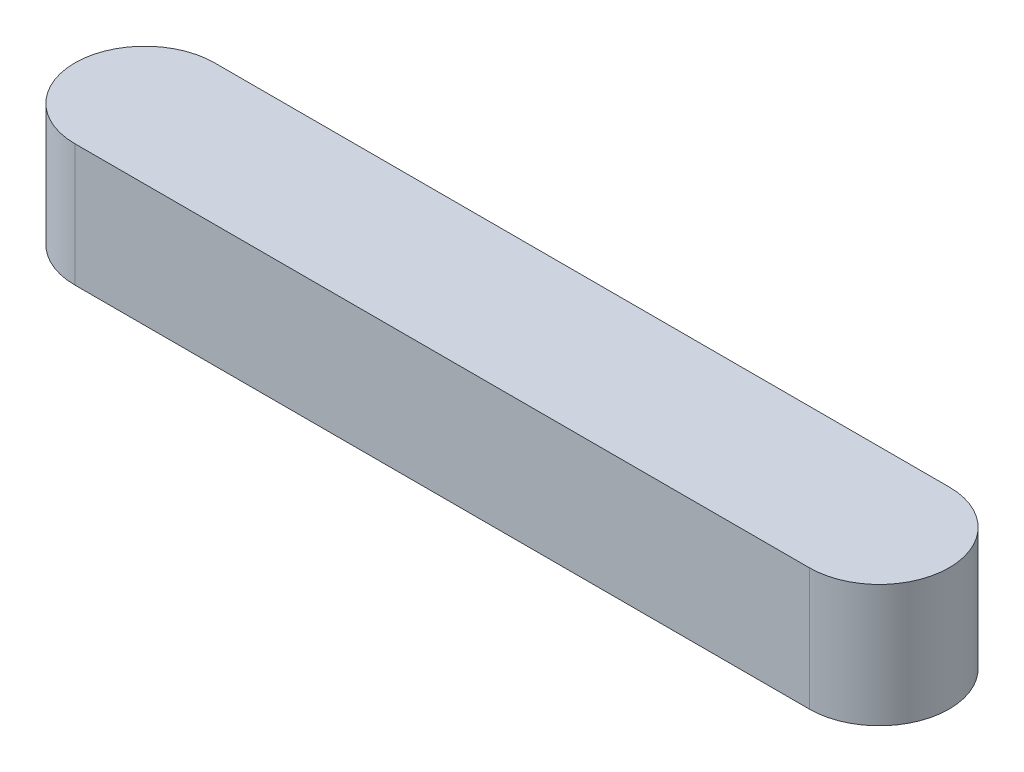
ISO-10303-21;
HEADER;
FILE_DESCRIPTION(('STEP AP214'),'2;1');
FILE_NAME('part.step','',(''),(''),'','','');
FILE_SCHEMA(('AUTOMOTIVE_DESIGN { 1 0 10303 214 1 1 1 1 }'));
ENDSEC;
DATA;
#1=APPLICATION_CONTEXT('core data for automotive mechanical design processes');
#2=APPLICATION_PROTOCOL_DEFINITION('international standard','automotive_design',2000,#1);
#3=PRODUCT_CONTEXT('',#1,'mechanical');
#4=PRODUCT('Part','Part','',(#3));
#5=PRODUCT_RELATED_PRODUCT_CATEGORY('part','',(#4));
#6=PRODUCT_DEFINITION_FORMATION('','',#4);
#7=PRODUCT_DEFINITION_CONTEXT('part definition',#1,'design');
#8=PRODUCT_DEFINITION('design','',#6,#7);
#9=PRODUCT_DEFINITION_SHAPE('','',#8);
#10=(LENGTH_UNIT() NAMED_UNIT(*) SI_UNIT(.MILLI.,.METRE.));
#11=(NAMED_UNIT(*) PLANE_ANGLE_UNIT() SI_UNIT($,.RADIAN.));
#12=(NAMED_UNIT(*) SI_UNIT($,.STERADIAN.) SOLID_ANGLE_UNIT());
#13=UNCERTAINTY_MEASURE_WITH_UNIT(LENGTH_MEASURE(1.E-05),#10,'distance_accuracy_value','');
#14=(GEOMETRIC_REPRESENTATION_CONTEXT(3) GLOBAL_UNCERTAINTY_ASSIGNED_CONTEXT((#13)) GLOBAL_UNIT_ASSIGNED_CONTEXT((#10,
#11,#12)) REPRESENTATION_CONTEXT('',''));
#15=CARTESIAN_POINT('',(0.,0.,0.));
#16=DIRECTION('',(0.,0.,1.));
#17=DIRECTION('',(1.,0.,0.));
#18=AXIS2_PLACEMENT_3D('',#15,#16,#17);
#19=CARTESIAN_POINT('',(0.,7.,0.));
#20=DIRECTION('',(0.,-1.,0.));
#21=DIRECTION('',(0.,0.,-1.));
#22=AXIS2_PLACEMENT_3D('',#19,#20,#21);
#23=CYLINDRICAL_SURFACE('',#22,4.);
#24=CARTESIAN_POINT('',(0.,0.,0.));
#25=DIRECTION('',(0.,1.,0.));
#26=DIRECTION('',(0.,0.,1.));
#27=AXIS2_PLACEMENT_3D('',#24,#25,#26);
#28=CIRCLE('',#27,4.);
#29=CARTESIAN_POINT('',(0.,0.,-4.));
#30=VERTEX_POINT('',#29);
#31=CARTESIAN_POINT('',(0.,0.,4.));
#32=VERTEX_POINT('',#31);
#33=EDGE_CURVE('E98',#30,#32,#28,.T.);
#34=ORIENTED_EDGE('',*,*,#33,.T.);
#35=DIRECTION('',(0.,-1.,0.));
#36=VECTOR('',#35,1.);
#37=CARTESIAN_POINT('',(0.,7.,4.));
#38=LINE('',#37,#36);
#39=CARTESIAN_POINT('',(0.,7.,4.));
#40=VERTEX_POINT('',#39);
#41=EDGE_CURVE('E11',#40,#32,#38,.T.);
#42=ORIENTED_EDGE('',*,*,#41,.F.);
#43=CARTESIAN_POINT('',(0.,7.,0.));
#44=DIRECTION('',(0.,1.,0.));
#45=DIRECTION('',(0.,0.,1.));
#46=AXIS2_PLACEMENT_3D('',#43,#44,#45);
#47=CIRCLE('',#46,4.);
#48=CARTESIAN_POINT('',(0.,7.,-4.));
#49=VERTEX_POINT('',#48);
#50=EDGE_CURVE('E86',#49,#40,#47,.T.);
#51=ORIENTED_EDGE('',*,*,#50,.F.);
#52=DIRECTION('',(0.,-1.,0.));
#53=VECTOR('',#52,1.);
#54=CARTESIAN_POINT('',(0.,7.,-4.));
#55=LINE('',#54,#53);
#56=EDGE_CURVE('E94',#49,#30,#55,.T.);
#57=ORIENTED_EDGE('',*,*,#56,.T.);
#58=EDGE_LOOP('',(#34,#42,#51,#57));
#59=FACE_BOUND('',#58,.T.);
#60=ADVANCED_FACE('F35',(#59),#23,.T.);
#61=CARTESIAN_POINT('',(0.,7.,4.));
#62=DIRECTION('',(0.,0.,-1.));
#63=DIRECTION('',(-1.,0.,0.));
#64=AXIS2_PLACEMENT_3D('',#61,#62,#63);
#65=PLANE('',#64);
#66=DIRECTION('',(1.,0.,0.));
#67=VECTOR('',#66,1.);
#68=CARTESIAN_POINT('',(0.,0.,4.));
#69=LINE('',#68,#67);
#70=CARTESIAN_POINT('',(42.,0.,4.));
#71=VERTEX_POINT('',#70);
#72=EDGE_CURVE('E90',#32,#71,#69,.T.);
#73=ORIENTED_EDGE('',*,*,#72,.T.);
#74=DIRECTION('',(0.,-1.,0.));
#75=VECTOR('',#74,1.);
#76=CARTESIAN_POINT('',(42.,7.,4.));
#77=LINE('',#76,#75);
#78=CARTESIAN_POINT('',(42.,7.,4.));
#79=VERTEX_POINT('',#78);
#80=EDGE_CURVE('E43',#79,#71,#77,.T.);
#81=ORIENTED_EDGE('',*,*,#80,.F.);
#82=DIRECTION('',(1.,0.,0.));
#83=VECTOR('',#82,1.);
#84=CARTESIAN_POINT('',(0.,7.,4.));
#85=LINE('',#84,#83);
#86=EDGE_CURVE('E81',#40,#79,#85,.T.);
#87=ORIENTED_EDGE('',*,*,#86,.F.);
#88=ORIENTED_EDGE('',*,*,#41,.T.);
#89=EDGE_LOOP('',(#73,#81,#87,#88));
#90=FACE_BOUND('',#89,.T.);
#91=ADVANCED_FACE('F89',(#90),#65,.F.);
#92=CARTESIAN_POINT('',(42.,7.,0.));
#93=DIRECTION('',(0.,-1.,0.));
#94=DIRECTION('',(0.,0.,-1.));
#95=AXIS2_PLACEMENT_3D('',#92,#93,#94);
#96=CYLINDRICAL_SURFACE('',#95,4.);
#97=CARTESIAN_POINT('',(42.,0.,0.));
#98=DIRECTION('',(0.,1.,0.));
#99=DIRECTION('',(0.,0.,1.));
#100=AXIS2_PLACEMENT_3D('',#97,#98,#99);
#101=CIRCLE('',#100,4.);
#102=CARTESIAN_POINT('',(42.,0.,-4.));
#103=VERTEX_POINT('',#102);
#104=EDGE_CURVE('E68',#71,#103,#101,.T.);
#105=ORIENTED_EDGE('',*,*,#104,.T.);
#106=DIRECTION('',(0.,-1.,0.));
#107=VECTOR('',#106,1.);
#108=CARTESIAN_POINT('',(42.,7.,-4.));
#109=LINE('',#108,#107);
#110=CARTESIAN_POINT('',(42.,7.,-4.));
#111=VERTEX_POINT('',#110);
#112=EDGE_CURVE('E91',#111,#103,#109,.T.);
#113=ORIENTED_EDGE('',*,*,#112,.F.);
#114=CARTESIAN_POINT('',(42.,7.,0.));
#115=DIRECTION('',(0.,1.,0.));
#116=DIRECTION('',(0.,0.,1.));
#117=AXIS2_PLACEMENT_3D('',#114,#115,#116);
#118=CIRCLE('',#117,4.);
#119=EDGE_CURVE('E84',#79,#111,#118,.T.);
#120=ORIENTED_EDGE('',*,*,#119,.F.);
#121=ORIENTED_EDGE('',*,*,#80,.T.);
#122=EDGE_LOOP('',(#105,#113,#120,#121));
#123=FACE_BOUND('',#122,.T.);
#124=ADVANCED_FACE('F92',(#123),#96,.T.);
#125=CARTESIAN_POINT('',(0.,7.,-4.));
#126=DIRECTION('',(0.,0.,1.));
#127=DIRECTION('',(1.,0.,0.));
#128=AXIS2_PLACEMENT_3D('',#125,#126,#127);
#129=PLANE('',#128);
#130=DIRECTION('',(-1.,0.,0.));
#131=VECTOR('',#130,1.);
#132=CARTESIAN_POINT('',(0.,0.,-4.));
#133=LINE('',#132,#131);
#134=EDGE_CURVE('E74',#103,#30,#133,.T.);
#135=ORIENTED_EDGE('',*,*,#134,.T.);
#136=ORIENTED_EDGE('',*,*,#56,.F.);
#137=DIRECTION('',(-1.,0.,0.));
#138=VECTOR('',#137,1.);
#139=CARTESIAN_POINT('',(0.,7.,-4.));
#140=LINE('',#139,#138);
#141=EDGE_CURVE('E51',#111,#49,#140,.T.);
#142=ORIENTED_EDGE('',*,*,#141,.F.);
#143=ORIENTED_EDGE('',*,*,#112,.T.);
#144=EDGE_LOOP('',(#135,#136,#142,#143));
#145=FACE_BOUND('',#144,.T.);
#146=ADVANCED_FACE('F105',(#145),#129,.F.);
#147=CARTESIAN_POINT('',(0.,7.,0.));
#148=DIRECTION('',(0.,1.,0.));
#149=DIRECTION('',(0.,0.,1.));
#150=AXIS2_PLACEMENT_3D('',#147,#148,#149);
#151=PLANE('',#150);
#152=ORIENTED_EDGE('',*,*,#50,.T.);
#153=ORIENTED_EDGE('',*,*,#86,.T.);
#154=ORIENTED_EDGE('',*,*,#119,.T.);
#155=ORIENTED_EDGE('',*,*,#141,.T.);
#156=EDGE_LOOP('',(#152,#153,#154,#155));
#157=FACE_BOUND('',#156,.T.);
#158=ADVANCED_FACE('F82',(#157),#151,.T.);
#159=CARTESIAN_POINT('',(0.,0.,0.));
#160=DIRECTION('',(0.,1.,0.));
#161=DIRECTION('',(0.,0.,1.));
#162=AXIS2_PLACEMENT_3D('',#159,#160,#161);
#163=PLANE('',#162);
#164=ORIENTED_EDGE('',*,*,#33,.F.);
#165=ORIENTED_EDGE('',*,*,#134,.F.);
#166=ORIENTED_EDGE('',*,*,#104,.F.);
#167=ORIENTED_EDGE('',*,*,#72,.F.);
#168=EDGE_LOOP('',(#164,#165,#166,#167));
#169=FACE_BOUND('',#168,.T.);
#170=ADVANCED_FACE('F108',(#169),#163,.F.);
#171=CLOSED_SHELL('',(#60,#91,#124,#146,#158,#170));
#172=MANIFOLD_SOLID_BREP('B2',#171);
#173=ADVANCED_BREP_SHAPE_REPRESENTATION('',(#18,#172),#14);
#174=SHAPE_DEFINITION_REPRESENTATION(#9,#173);
ENDSEC;
END-ISO-10303-21;
